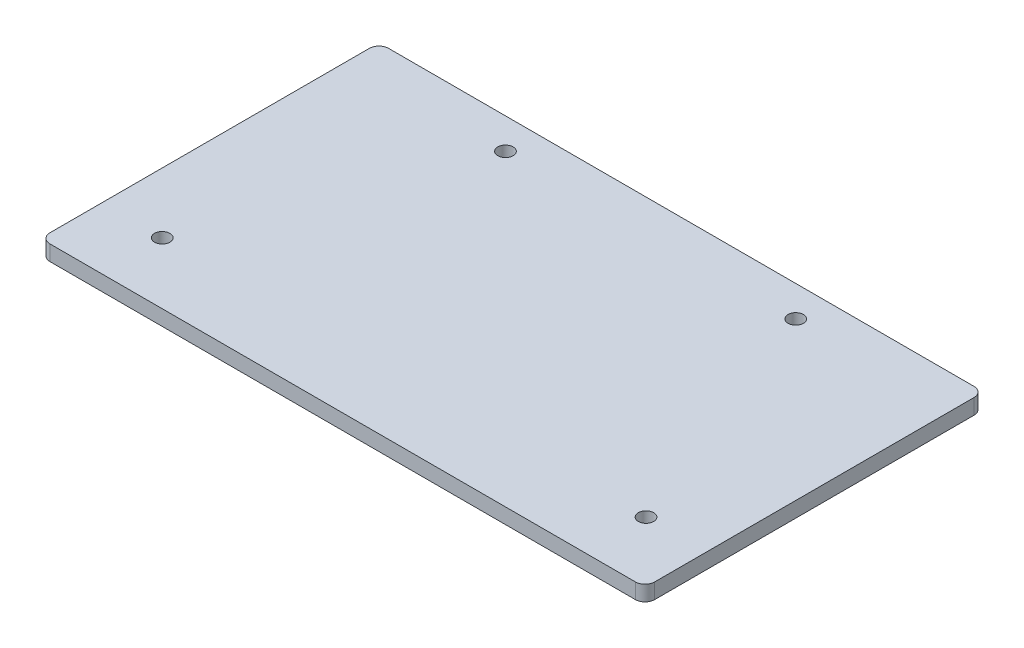
ISO-10303-21;
HEADER;
FILE_DESCRIPTION(('STEP AP214'),'2;1');
FILE_NAME('part.step','',(''),(''),'','','');
FILE_SCHEMA(('AUTOMOTIVE_DESIGN { 1 0 10303 214 1 1 1 1 }'));
ENDSEC;
DATA;
#1=APPLICATION_CONTEXT('core data for automotive mechanical design processes');
#2=APPLICATION_PROTOCOL_DEFINITION('international standard','automotive_design',2000,#1);
#3=PRODUCT_CONTEXT('',#1,'mechanical');
#4=PRODUCT('Part','Part','',(#3));
#5=PRODUCT_RELATED_PRODUCT_CATEGORY('part','',(#4));
#6=PRODUCT_DEFINITION_FORMATION('','',#4);
#7=PRODUCT_DEFINITION_CONTEXT('part definition',#1,'design');
#8=PRODUCT_DEFINITION('design','',#6,#7);
#9=PRODUCT_DEFINITION_SHAPE('','',#8);
#10=(LENGTH_UNIT() NAMED_UNIT(*) SI_UNIT(.MILLI.,.METRE.));
#11=(NAMED_UNIT(*) PLANE_ANGLE_UNIT() SI_UNIT($,.RADIAN.));
#12=(NAMED_UNIT(*) SI_UNIT($,.STERADIAN.) SOLID_ANGLE_UNIT());
#13=UNCERTAINTY_MEASURE_WITH_UNIT(LENGTH_MEASURE(1.E-05),#10,'distance_accuracy_value','');
#14=(GEOMETRIC_REPRESENTATION_CONTEXT(3) GLOBAL_UNCERTAINTY_ASSIGNED_CONTEXT((#13)) GLOBAL_UNIT_ASSIGNED_CONTEXT((#10,
#11,#12)) REPRESENTATION_CONTEXT('',''));
#15=CARTESIAN_POINT('',(0.,0.,0.));
#16=DIRECTION('',(0.,0.,1.));
#17=DIRECTION('',(1.,0.,0.));
#18=AXIS2_PLACEMENT_3D('',#15,#16,#17);
#19=CARTESIAN_POINT('',(-60.5,3.175,68.));
#20=DIRECTION('',(0.,1.,0.));
#21=DIRECTION('',(0.,0.,1.));
#22=AXIS2_PLACEMENT_3D('',#19,#20,#21);
#23=PLANE('',#22);
#24=CARTESIAN_POINT('',(-50.,3.175,57.3));
#25=DIRECTION('',(0.,1.,0.));
#26=DIRECTION('',(0.,0.,1.));
#27=AXIS2_PLACEMENT_3D('',#24,#25,#26);
#28=CIRCLE('',#27,1.5875);
#29=CARTESIAN_POINT('',(-50.,3.175,58.8875));
#30=VERTEX_POINT('',#29);
#31=EDGE_CURVE('E188',#30,#30,#28,.T.);
#32=ORIENTED_EDGE('',*,*,#31,.F.);
#33=EDGE_LOOP('',(#32));
#34=FACE_BOUND('',#33,.T.);
#35=CARTESIAN_POINT('',(-30.,3.175,6.35));
#36=DIRECTION('',(0.,1.,0.));
#37=DIRECTION('',(0.,0.,1.));
#38=AXIS2_PLACEMENT_3D('',#35,#36,#37);
#39=CIRCLE('',#38,1.5875);
#40=CARTESIAN_POINT('',(-30.,3.175,7.9375));
#41=VERTEX_POINT('',#40);
#42=EDGE_CURVE('E134',#41,#41,#39,.T.);
#43=ORIENTED_EDGE('',*,*,#42,.F.);
#44=EDGE_LOOP('',(#43));
#45=FACE_BOUND('',#44,.T.);
#46=CARTESIAN_POINT('',(-60.5,3.175,68.));
#47=DIRECTION('',(0.,1.,0.));
#48=DIRECTION('',(0.,0.,1.));
#49=AXIS2_PLACEMENT_3D('',#46,#47,#48);
#50=CIRCLE('',#49,2.);
#51=CARTESIAN_POINT('',(-62.5,3.175,68.));
#52=VERTEX_POINT('',#51);
#53=CARTESIAN_POINT('',(-60.5,3.175,70.));
#54=VERTEX_POINT('',#53);
#55=EDGE_CURVE('E145',#52,#54,#50,.T.);
#56=ORIENTED_EDGE('',*,*,#55,.T.);
#57=DIRECTION('',(1.,0.,0.));
#58=VECTOR('',#57,1.);
#59=CARTESIAN_POINT('',(-60.5,3.175,70.));
#60=LINE('',#59,#58);
#61=CARTESIAN_POINT('',(60.5,3.175,70.));
#62=VERTEX_POINT('',#61);
#63=EDGE_CURVE('E93',#54,#62,#60,.T.);
#64=ORIENTED_EDGE('',*,*,#63,.T.);
#65=CARTESIAN_POINT('',(60.5,3.175,68.));
#66=DIRECTION('',(0.,1.,0.));
#67=DIRECTION('',(0.,0.,1.));
#68=AXIS2_PLACEMENT_3D('',#65,#66,#67);
#69=CIRCLE('',#68,2.);
#70=CARTESIAN_POINT('',(62.5,3.175,68.));
#71=VERTEX_POINT('',#70);
#72=EDGE_CURVE('E160',#62,#71,#69,.T.);
#73=ORIENTED_EDGE('',*,*,#72,.T.);
#74=DIRECTION('',(0.,0.,-1.));
#75=VECTOR('',#74,1.);
#76=CARTESIAN_POINT('',(62.5,3.175,2.));
#77=LINE('',#76,#75);
#78=CARTESIAN_POINT('',(62.5,3.175,2.));
#79=VERTEX_POINT('',#78);
#80=EDGE_CURVE('E173',#71,#79,#77,.T.);
#81=ORIENTED_EDGE('',*,*,#80,.T.);
#82=CARTESIAN_POINT('',(60.5,3.175,2.));
#83=DIRECTION('',(0.,1.,0.));
#84=DIRECTION('',(0.,0.,-1.));
#85=AXIS2_PLACEMENT_3D('',#82,#83,#84);
#86=CIRCLE('',#85,2.);
#87=CARTESIAN_POINT('',(60.5,3.175,0.));
#88=VERTEX_POINT('',#87);
#89=EDGE_CURVE('E112',#79,#88,#86,.T.);
#90=ORIENTED_EDGE('',*,*,#89,.T.);
#91=DIRECTION('',(-1.,0.,0.));
#92=VECTOR('',#91,1.);
#93=CARTESIAN_POINT('',(-60.5,3.175,0.));
#94=LINE('',#93,#92);
#95=CARTESIAN_POINT('',(-60.5,3.175,0.));
#96=VERTEX_POINT('',#95);
#97=EDGE_CURVE('E106',#88,#96,#94,.T.);
#98=ORIENTED_EDGE('',*,*,#97,.T.);
#99=CARTESIAN_POINT('',(-60.5,3.175,2.));
#100=DIRECTION('',(0.,1.,0.));
#101=DIRECTION('',(0.,0.,1.));
#102=AXIS2_PLACEMENT_3D('',#99,#100,#101);
#103=CIRCLE('',#102,2.);
#104=CARTESIAN_POINT('',(-62.5,3.175,2.));
#105=VERTEX_POINT('',#104);
#106=EDGE_CURVE('E110',#96,#105,#103,.T.);
#107=ORIENTED_EDGE('',*,*,#106,.T.);
#108=DIRECTION('',(0.,0.,1.));
#109=VECTOR('',#108,1.);
#110=CARTESIAN_POINT('',(-62.5,3.175,2.));
#111=LINE('',#110,#109);
#112=EDGE_CURVE('E50',#105,#52,#111,.T.);
#113=ORIENTED_EDGE('',*,*,#112,.T.);
#114=EDGE_LOOP('',(#56,#64,#73,#81,#90,#98,#107,#113));
#115=FACE_BOUND('',#114,.T.);
#116=CARTESIAN_POINT('',(30.,3.175,6.35));
#117=DIRECTION('',(0.,1.,0.));
#118=DIRECTION('',(0.,0.,1.));
#119=AXIS2_PLACEMENT_3D('',#116,#117,#118);
#120=CIRCLE('',#119,1.5875);
#121=CARTESIAN_POINT('',(30.,3.175,7.9375));
#122=VERTEX_POINT('',#121);
#123=EDGE_CURVE('E182',#122,#122,#120,.T.);
#124=ORIENTED_EDGE('',*,*,#123,.F.);
#125=EDGE_LOOP('',(#124));
#126=FACE_BOUND('',#125,.T.);
#127=CARTESIAN_POINT('',(50.,3.175,57.3));
#128=DIRECTION('',(0.,1.,0.));
#129=DIRECTION('',(0.,0.,1.));
#130=AXIS2_PLACEMENT_3D('',#127,#128,#129);
#131=CIRCLE('',#130,1.5875);
#132=CARTESIAN_POINT('',(50.,3.175,58.8875));
#133=VERTEX_POINT('',#132);
#134=EDGE_CURVE('E194',#133,#133,#131,.T.);
#135=ORIENTED_EDGE('',*,*,#134,.F.);
#136=EDGE_LOOP('',(#135));
#137=FACE_BOUND('',#136,.T.);
#138=ADVANCED_FACE('F33',(#34,#45,#115,#126,#137),#23,.T.);
#139=CARTESIAN_POINT('',(-60.5,0.,68.));
#140=DIRECTION('',(0.,1.,0.));
#141=DIRECTION('',(0.,0.,1.));
#142=AXIS2_PLACEMENT_3D('',#139,#140,#141);
#143=PLANE('',#142);
#144=CARTESIAN_POINT('',(-60.5,0.,68.));
#145=DIRECTION('',(0.,1.,0.));
#146=DIRECTION('',(0.,0.,1.));
#147=AXIS2_PLACEMENT_3D('',#144,#145,#146);
#148=CIRCLE('',#147,2.);
#149=CARTESIAN_POINT('',(-62.5,0.,68.));
#150=VERTEX_POINT('',#149);
#151=CARTESIAN_POINT('',(-60.5,0.,70.));
#152=VERTEX_POINT('',#151);
#153=EDGE_CURVE('E130',#150,#152,#148,.T.);
#154=ORIENTED_EDGE('',*,*,#153,.F.);
#155=DIRECTION('',(0.,0.,1.));
#156=VECTOR('',#155,1.);
#157=CARTESIAN_POINT('',(-62.5,0.,2.));
#158=LINE('',#157,#156);
#159=CARTESIAN_POINT('',(-62.5,0.,2.));
#160=VERTEX_POINT('',#159);
#161=EDGE_CURVE('E85',#160,#150,#158,.T.);
#162=ORIENTED_EDGE('',*,*,#161,.F.);
#163=CARTESIAN_POINT('',(-60.5,0.,2.));
#164=DIRECTION('',(0.,1.,0.));
#165=DIRECTION('',(0.,0.,1.));
#166=AXIS2_PLACEMENT_3D('',#163,#164,#165);
#167=CIRCLE('',#166,2.);
#168=CARTESIAN_POINT('',(-60.5,0.,0.));
#169=VERTEX_POINT('',#168);
#170=EDGE_CURVE('E79',#169,#160,#167,.T.);
#171=ORIENTED_EDGE('',*,*,#170,.F.);
#172=DIRECTION('',(-1.,0.,0.));
#173=VECTOR('',#172,1.);
#174=CARTESIAN_POINT('',(-60.5,0.,0.));
#175=LINE('',#174,#173);
#176=CARTESIAN_POINT('',(60.5,0.,0.));
#177=VERTEX_POINT('',#176);
#178=EDGE_CURVE('E120',#177,#169,#175,.T.);
#179=ORIENTED_EDGE('',*,*,#178,.F.);
#180=CARTESIAN_POINT('',(60.5,0.,2.));
#181=DIRECTION('',(0.,1.,0.));
#182=DIRECTION('',(0.,0.,-1.));
#183=AXIS2_PLACEMENT_3D('',#180,#181,#182);
#184=CIRCLE('',#183,2.);
#185=CARTESIAN_POINT('',(62.5,0.,2.));
#186=VERTEX_POINT('',#185);
#187=EDGE_CURVE('E140',#186,#177,#184,.T.);
#188=ORIENTED_EDGE('',*,*,#187,.F.);
#189=DIRECTION('',(0.,0.,-1.));
#190=VECTOR('',#189,1.);
#191=CARTESIAN_POINT('',(62.5,0.,2.));
#192=LINE('',#191,#190);
#193=CARTESIAN_POINT('',(62.5,0.,68.));
#194=VERTEX_POINT('',#193);
#195=EDGE_CURVE('E138',#194,#186,#192,.T.);
#196=ORIENTED_EDGE('',*,*,#195,.F.);
#197=CARTESIAN_POINT('',(60.5,0.,68.));
#198=DIRECTION('',(0.,1.,0.));
#199=DIRECTION('',(0.,0.,1.));
#200=AXIS2_PLACEMENT_3D('',#197,#198,#199);
#201=CIRCLE('',#200,2.);
#202=CARTESIAN_POINT('',(60.5,0.,70.));
#203=VERTEX_POINT('',#202);
#204=EDGE_CURVE('E136',#203,#194,#201,.T.);
#205=ORIENTED_EDGE('',*,*,#204,.F.);
#206=DIRECTION('',(1.,0.,0.));
#207=VECTOR('',#206,1.);
#208=CARTESIAN_POINT('',(-60.5,0.,70.));
#209=LINE('',#208,#207);
#210=EDGE_CURVE('E133',#152,#203,#209,.T.);
#211=ORIENTED_EDGE('',*,*,#210,.F.);
#212=EDGE_LOOP('',(#154,#162,#171,#179,#188,#196,#205,#211));
#213=FACE_BOUND('',#212,.T.);
#214=CARTESIAN_POINT('',(-30.,0.,6.35));
#215=DIRECTION('',(0.,1.,0.));
#216=DIRECTION('',(0.,0.,1.));
#217=AXIS2_PLACEMENT_3D('',#214,#215,#216);
#218=CIRCLE('',#217,1.5875);
#219=CARTESIAN_POINT('',(-30.,0.,7.9375));
#220=VERTEX_POINT('',#219);
#221=EDGE_CURVE('E179',#220,#220,#218,.T.);
#222=ORIENTED_EDGE('',*,*,#221,.T.);
#223=EDGE_LOOP('',(#222));
#224=FACE_BOUND('',#223,.T.);
#225=CARTESIAN_POINT('',(30.,0.,6.35));
#226=DIRECTION('',(0.,1.,0.));
#227=DIRECTION('',(0.,0.,1.));
#228=AXIS2_PLACEMENT_3D('',#225,#226,#227);
#229=CIRCLE('',#228,1.5875);
#230=CARTESIAN_POINT('',(30.,0.,7.9375));
#231=VERTEX_POINT('',#230);
#232=EDGE_CURVE('E185',#231,#231,#229,.T.);
#233=ORIENTED_EDGE('',*,*,#232,.T.);
#234=EDGE_LOOP('',(#233));
#235=FACE_BOUND('',#234,.T.);
#236=CARTESIAN_POINT('',(-50.,0.,57.3));
#237=DIRECTION('',(0.,1.,0.));
#238=DIRECTION('',(0.,0.,1.));
#239=AXIS2_PLACEMENT_3D('',#236,#237,#238);
#240=CIRCLE('',#239,1.5875);
#241=CARTESIAN_POINT('',(-50.,0.,58.8875));
#242=VERTEX_POINT('',#241);
#243=EDGE_CURVE('E191',#242,#242,#240,.T.);
#244=ORIENTED_EDGE('',*,*,#243,.T.);
#245=EDGE_LOOP('',(#244));
#246=FACE_BOUND('',#245,.T.);
#247=CARTESIAN_POINT('',(50.,0.,57.3));
#248=DIRECTION('',(0.,1.,0.));
#249=DIRECTION('',(0.,0.,1.));
#250=AXIS2_PLACEMENT_3D('',#247,#248,#249);
#251=CIRCLE('',#250,1.5875);
#252=CARTESIAN_POINT('',(50.,0.,58.8875));
#253=VERTEX_POINT('',#252);
#254=EDGE_CURVE('E197',#253,#253,#251,.T.);
#255=ORIENTED_EDGE('',*,*,#254,.T.);
#256=EDGE_LOOP('',(#255));
#257=FACE_BOUND('',#256,.T.);
#258=ADVANCED_FACE('F164',(#213,#224,#235,#246,#257),#143,.F.);
#259=CARTESIAN_POINT('',(-60.5,3.175,68.));
#260=DIRECTION('',(0.,-1.,0.));
#261=DIRECTION('',(0.,0.,-1.));
#262=AXIS2_PLACEMENT_3D('',#259,#260,#261);
#263=CYLINDRICAL_SURFACE('',#262,2.);
#264=ORIENTED_EDGE('',*,*,#153,.T.);
#265=DIRECTION('',(0.,-1.,0.));
#266=VECTOR('',#265,1.);
#267=CARTESIAN_POINT('',(-60.5,3.175,70.));
#268=LINE('',#267,#266);
#269=EDGE_CURVE('E11',#54,#152,#268,.T.);
#270=ORIENTED_EDGE('',*,*,#269,.F.);
#271=ORIENTED_EDGE('',*,*,#55,.F.);
#272=DIRECTION('',(0.,-1.,0.));
#273=VECTOR('',#272,1.);
#274=CARTESIAN_POINT('',(-62.5,3.175,68.));
#275=LINE('',#274,#273);
#276=EDGE_CURVE('E126',#52,#150,#275,.T.);
#277=ORIENTED_EDGE('',*,*,#276,.T.);
#278=EDGE_LOOP('',(#264,#270,#271,#277));
#279=FACE_BOUND('',#278,.T.);
#280=ADVANCED_FACE('F35',(#279),#263,.T.);
#281=CARTESIAN_POINT('',(-60.5,3.175,70.));
#282=DIRECTION('',(0.,0.,-1.));
#283=DIRECTION('',(-1.,0.,0.));
#284=AXIS2_PLACEMENT_3D('',#281,#282,#283);
#285=PLANE('',#284);
#286=ORIENTED_EDGE('',*,*,#210,.T.);
#287=DIRECTION('',(0.,-1.,0.));
#288=VECTOR('',#287,1.);
#289=CARTESIAN_POINT('',(60.5,3.175,70.));
#290=LINE('',#289,#288);
#291=EDGE_CURVE('E42',#62,#203,#290,.T.);
#292=ORIENTED_EDGE('',*,*,#291,.F.);
#293=ORIENTED_EDGE('',*,*,#63,.F.);
#294=ORIENTED_EDGE('',*,*,#269,.T.);
#295=EDGE_LOOP('',(#286,#292,#293,#294));
#296=FACE_BOUND('',#295,.T.);
#297=ADVANCED_FACE('F231',(#296),#285,.F.);
#298=CARTESIAN_POINT('',(60.5,3.175,68.));
#299=DIRECTION('',(0.,-1.,0.));
#300=DIRECTION('',(0.,0.,-1.));
#301=AXIS2_PLACEMENT_3D('',#298,#299,#300);
#302=CYLINDRICAL_SURFACE('',#301,2.);
#303=ORIENTED_EDGE('',*,*,#204,.T.);
#304=DIRECTION('',(0.,-1.,0.));
#305=VECTOR('',#304,1.);
#306=CARTESIAN_POINT('',(62.5,3.175,68.));
#307=LINE('',#306,#305);
#308=EDGE_CURVE('E152',#71,#194,#307,.T.);
#309=ORIENTED_EDGE('',*,*,#308,.F.);
#310=ORIENTED_EDGE('',*,*,#72,.F.);
#311=ORIENTED_EDGE('',*,*,#291,.T.);
#312=EDGE_LOOP('',(#303,#309,#310,#311));
#313=FACE_BOUND('',#312,.T.);
#314=ADVANCED_FACE('F158',(#313),#302,.T.);
#315=CARTESIAN_POINT('',(62.5,3.175,2.));
#316=DIRECTION('',(-1.,0.,0.));
#317=DIRECTION('',(0.,0.,1.));
#318=AXIS2_PLACEMENT_3D('',#315,#316,#317);
#319=PLANE('',#318);
#320=ORIENTED_EDGE('',*,*,#195,.T.);
#321=DIRECTION('',(0.,-1.,0.));
#322=VECTOR('',#321,1.);
#323=CARTESIAN_POINT('',(62.5,3.175,2.));
#324=LINE('',#323,#322);
#325=EDGE_CURVE('E149',#79,#186,#324,.T.);
#326=ORIENTED_EDGE('',*,*,#325,.F.);
#327=ORIENTED_EDGE('',*,*,#80,.F.);
#328=ORIENTED_EDGE('',*,*,#308,.T.);
#329=EDGE_LOOP('',(#320,#326,#327,#328));
#330=FACE_BOUND('',#329,.T.);
#331=ADVANCED_FACE('F169',(#330),#319,.F.);
#332=CARTESIAN_POINT('',(60.5,3.175,2.));
#333=DIRECTION('',(0.,-1.,0.));
#334=DIRECTION('',(0.,0.,-1.));
#335=AXIS2_PLACEMENT_3D('',#332,#333,#334);
#336=CYLINDRICAL_SURFACE('',#335,2.);
#337=ORIENTED_EDGE('',*,*,#187,.T.);
#338=DIRECTION('',(0.,-1.,0.));
#339=VECTOR('',#338,1.);
#340=CARTESIAN_POINT('',(60.5,3.175,0.));
#341=LINE('',#340,#339);
#342=EDGE_CURVE('E121',#88,#177,#341,.T.);
#343=ORIENTED_EDGE('',*,*,#342,.F.);
#344=ORIENTED_EDGE('',*,*,#89,.F.);
#345=ORIENTED_EDGE('',*,*,#325,.T.);
#346=EDGE_LOOP('',(#337,#343,#344,#345));
#347=FACE_BOUND('',#346,.T.);
#348=ADVANCED_FACE('F172',(#347),#336,.T.);
#349=CARTESIAN_POINT('',(-60.5,3.175,0.));
#350=DIRECTION('',(0.,0.,1.));
#351=DIRECTION('',(1.,0.,0.));
#352=AXIS2_PLACEMENT_3D('',#349,#350,#351);
#353=PLANE('',#352);
#354=ORIENTED_EDGE('',*,*,#178,.T.);
#355=DIRECTION('',(0.,-1.,0.));
#356=VECTOR('',#355,1.);
#357=CARTESIAN_POINT('',(-60.5,3.175,0.));
#358=LINE('',#357,#356);
#359=EDGE_CURVE('E117',#96,#169,#358,.T.);
#360=ORIENTED_EDGE('',*,*,#359,.F.);
#361=ORIENTED_EDGE('',*,*,#97,.F.);
#362=ORIENTED_EDGE('',*,*,#342,.T.);
#363=EDGE_LOOP('',(#354,#360,#361,#362));
#364=FACE_BOUND('',#363,.T.);
#365=ADVANCED_FACE('F118',(#364),#353,.F.);
#366=CARTESIAN_POINT('',(-60.5,3.175,2.));
#367=DIRECTION('',(0.,-1.,0.));
#368=DIRECTION('',(0.,0.,-1.));
#369=AXIS2_PLACEMENT_3D('',#366,#367,#368);
#370=CYLINDRICAL_SURFACE('',#369,2.);
#371=ORIENTED_EDGE('',*,*,#170,.T.);
#372=DIRECTION('',(0.,-1.,0.));
#373=VECTOR('',#372,1.);
#374=CARTESIAN_POINT('',(-62.5,3.175,2.));
#375=LINE('',#374,#373);
#376=EDGE_CURVE('E122',#105,#160,#375,.T.);
#377=ORIENTED_EDGE('',*,*,#376,.F.);
#378=ORIENTED_EDGE('',*,*,#106,.F.);
#379=ORIENTED_EDGE('',*,*,#359,.T.);
#380=EDGE_LOOP('',(#371,#377,#378,#379));
#381=FACE_BOUND('',#380,.T.);
#382=ADVANCED_FACE('F124',(#381),#370,.T.);
#383=CARTESIAN_POINT('',(-62.5,3.175,2.));
#384=DIRECTION('',(1.,0.,0.));
#385=DIRECTION('',(0.,0.,-1.));
#386=AXIS2_PLACEMENT_3D('',#383,#384,#385);
#387=PLANE('',#386);
#388=ORIENTED_EDGE('',*,*,#161,.T.);
#389=ORIENTED_EDGE('',*,*,#276,.F.);
#390=ORIENTED_EDGE('',*,*,#112,.F.);
#391=ORIENTED_EDGE('',*,*,#376,.T.);
#392=EDGE_LOOP('',(#388,#389,#390,#391));
#393=FACE_BOUND('',#392,.T.);
#394=ADVANCED_FACE('F219',(#393),#387,.F.);
#395=CARTESIAN_POINT('',(-30.,3.175,6.35));
#396=DIRECTION('',(0.,-1.,0.));
#397=DIRECTION('',(0.,0.,-1.));
#398=AXIS2_PLACEMENT_3D('',#395,#396,#397);
#399=CYLINDRICAL_SURFACE('',#398,1.5875);
#400=ORIENTED_EDGE('',*,*,#42,.T.);
#401=EDGE_LOOP('',(#400));
#402=FACE_BOUND('',#401,.T.);
#403=ORIENTED_EDGE('',*,*,#221,.F.);
#404=EDGE_LOOP('',(#403));
#405=FACE_BOUND('',#404,.T.);
#406=ADVANCED_FACE('F216',(#402,#405),#399,.F.);
#407=CARTESIAN_POINT('',(30.,3.175,6.35));
#408=DIRECTION('',(0.,-1.,0.));
#409=DIRECTION('',(0.,0.,-1.));
#410=AXIS2_PLACEMENT_3D('',#407,#408,#409);
#411=CYLINDRICAL_SURFACE('',#410,1.5875);
#412=ORIENTED_EDGE('',*,*,#123,.T.);
#413=EDGE_LOOP('',(#412));
#414=FACE_BOUND('',#413,.T.);
#415=ORIENTED_EDGE('',*,*,#232,.F.);
#416=EDGE_LOOP('',(#415));
#417=FACE_BOUND('',#416,.T.);
#418=ADVANCED_FACE('F295',(#414,#417),#411,.F.);
#419=CARTESIAN_POINT('',(-50.,3.175,57.3));
#420=DIRECTION('',(0.,-1.,0.));
#421=DIRECTION('',(0.,0.,-1.));
#422=AXIS2_PLACEMENT_3D('',#419,#420,#421);
#423=CYLINDRICAL_SURFACE('',#422,1.5875);
#424=ORIENTED_EDGE('',*,*,#31,.T.);
#425=EDGE_LOOP('',(#424));
#426=FACE_BOUND('',#425,.T.);
#427=ORIENTED_EDGE('',*,*,#243,.F.);
#428=EDGE_LOOP('',(#427));
#429=FACE_BOUND('',#428,.T.);
#430=ADVANCED_FACE('F303',(#426,#429),#423,.F.);
#431=CARTESIAN_POINT('',(50.,3.175,57.3));
#432=DIRECTION('',(0.,-1.,0.));
#433=DIRECTION('',(0.,0.,-1.));
#434=AXIS2_PLACEMENT_3D('',#431,#432,#433);
#435=CYLINDRICAL_SURFACE('',#434,1.5875);
#436=ORIENTED_EDGE('',*,*,#134,.T.);
#437=EDGE_LOOP('',(#436));
#438=FACE_BOUND('',#437,.T.);
#439=ORIENTED_EDGE('',*,*,#254,.F.);
#440=EDGE_LOOP('',(#439));
#441=FACE_BOUND('',#440,.T.);
#442=ADVANCED_FACE('F203',(#438,#441),#435,.F.);
#443=CLOSED_SHELL('',(#138,#258,#280,#297,#314,#331,#348,#365,#382,#394,#406,#418,#430,#442));
#444=MANIFOLD_SOLID_BREP('B2',#443);
#445=ADVANCED_BREP_SHAPE_REPRESENTATION('',(#18,#444),#14);
#446=SHAPE_DEFINITION_REPRESENTATION(#9,#445);
ENDSEC;
END-ISO-10303-21;
